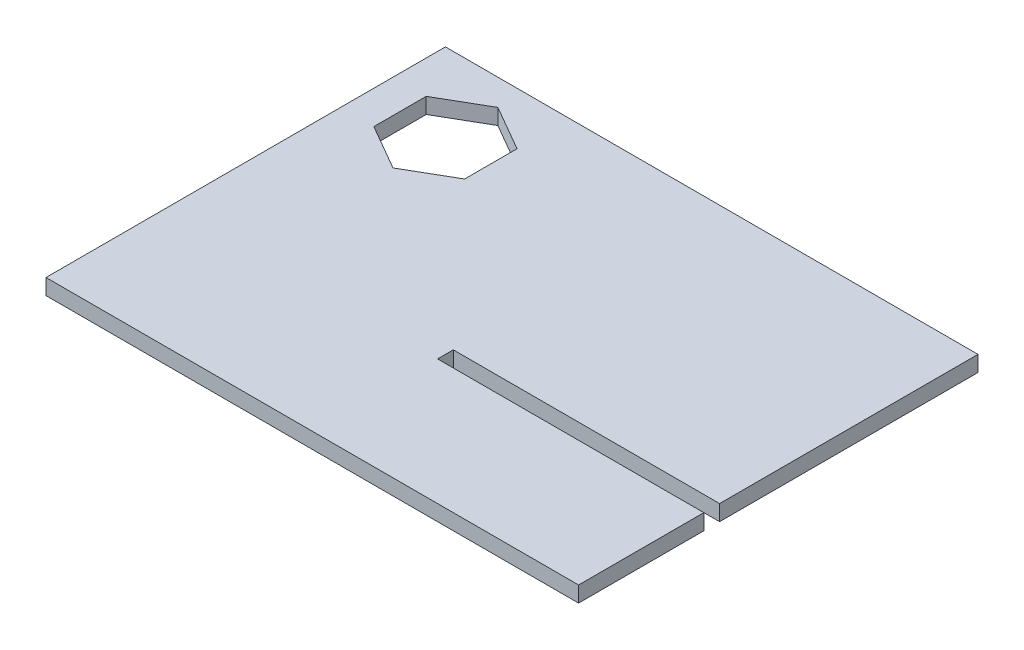
ISO-10303-21;
HEADER;
FILE_DESCRIPTION(('STEP AP214'),'2;1');
FILE_NAME('part.step','',(''),(''),'','','');
FILE_SCHEMA(('AUTOMOTIVE_DESIGN { 1 0 10303 214 1 1 1 1 }'));
ENDSEC;
DATA;
#1=APPLICATION_CONTEXT('core data for automotive mechanical design processes');
#2=APPLICATION_PROTOCOL_DEFINITION('international standard','automotive_design',2000,#1);
#3=PRODUCT_CONTEXT('',#1,'mechanical');
#4=PRODUCT('Part','Part','',(#3));
#5=PRODUCT_RELATED_PRODUCT_CATEGORY('part','',(#4));
#6=PRODUCT_DEFINITION_FORMATION('','',#4);
#7=PRODUCT_DEFINITION_CONTEXT('part definition',#1,'design');
#8=PRODUCT_DEFINITION('design','',#6,#7);
#9=PRODUCT_DEFINITION_SHAPE('','',#8);
#10=(LENGTH_UNIT() NAMED_UNIT(*) SI_UNIT(.MILLI.,.METRE.));
#11=(NAMED_UNIT(*) PLANE_ANGLE_UNIT() SI_UNIT($,.RADIAN.));
#12=(NAMED_UNIT(*) SI_UNIT($,.STERADIAN.) SOLID_ANGLE_UNIT());
#13=UNCERTAINTY_MEASURE_WITH_UNIT(LENGTH_MEASURE(1.E-05),#10,'distance_accuracy_value','');
#14=(GEOMETRIC_REPRESENTATION_CONTEXT(3) GLOBAL_UNCERTAINTY_ASSIGNED_CONTEXT((#13)) GLOBAL_UNIT_ASSIGNED_CONTEXT((#10,
#11,#12)) REPRESENTATION_CONTEXT('',''));
#15=CARTESIAN_POINT('',(0.,0.,0.));
#16=DIRECTION('',(0.,0.,1.));
#17=DIRECTION('',(1.,0.,0.));
#18=AXIS2_PLACEMENT_3D('',#15,#16,#17);
#19=CARTESIAN_POINT('',(101.6,3.,0.));
#20=DIRECTION('',(-1.,0.,0.));
#21=DIRECTION('',(0.,0.,1.));
#22=AXIS2_PLACEMENT_3D('',#19,#20,#21);
#23=PLANE('',#22);
#24=DIRECTION('',(0.,0.,-1.));
#25=VECTOR('',#24,1.);
#26=CARTESIAN_POINT('',(101.6,0.,0.));
#27=LINE('',#26,#25);
#28=CARTESIAN_POINT('',(101.6,0.,0.));
#29=VERTEX_POINT('',#28);
#30=CARTESIAN_POINT('',(101.6,0.,-23.9));
#31=VERTEX_POINT('',#30);
#32=EDGE_CURVE('E231',#29,#31,#27,.T.);
#33=ORIENTED_EDGE('',*,*,#32,.T.);
#34=DIRECTION('',(0.,1.,0.));
#35=VECTOR('',#34,1.);
#36=CARTESIAN_POINT('',(101.6,0.,-23.9));
#37=LINE('',#36,#35);
#38=CARTESIAN_POINT('',(101.6,3.,-23.9));
#39=VERTEX_POINT('',#38);
#40=EDGE_CURVE('E204',#31,#39,#37,.T.);
#41=ORIENTED_EDGE('',*,*,#40,.T.);
#42=DIRECTION('',(0.,0.,-1.));
#43=VECTOR('',#42,1.);
#44=CARTESIAN_POINT('',(101.6,3.,0.));
#45=LINE('',#44,#43);
#46=CARTESIAN_POINT('',(101.6,3.,0.));
#47=VERTEX_POINT('',#46);
#48=EDGE_CURVE('E220',#47,#39,#45,.T.);
#49=ORIENTED_EDGE('',*,*,#48,.F.);
#50=DIRECTION('',(0.,-1.,0.));
#51=VECTOR('',#50,1.);
#52=CARTESIAN_POINT('',(101.6,3.,0.));
#53=LINE('',#52,#51);
#54=EDGE_CURVE('E41',#47,#29,#53,.T.);
#55=ORIENTED_EDGE('',*,*,#54,.T.);
#56=EDGE_LOOP('',(#33,#41,#49,#55));
#57=FACE_BOUND('',#56,.T.);
#58=ADVANCED_FACE('F33',(#57),#23,.F.);
#59=CARTESIAN_POINT('',(0.,3.,0.));
#60=DIRECTION('',(1.,0.,0.));
#61=DIRECTION('',(0.,0.,-1.));
#62=AXIS2_PLACEMENT_3D('',#59,#60,#61);
#63=PLANE('',#62);
#64=DIRECTION('',(0.,0.,1.));
#65=VECTOR('',#64,1.);
#66=CARTESIAN_POINT('',(0.,0.,0.));
#67=LINE('',#66,#65);
#68=CARTESIAN_POINT('',(0.,0.,-76.2));
#69=VERTEX_POINT('',#68);
#70=CARTESIAN_POINT('',(0.,0.,0.));
#71=VERTEX_POINT('',#70);
#72=EDGE_CURVE('E207',#69,#71,#67,.T.);
#73=ORIENTED_EDGE('',*,*,#72,.T.);
#74=DIRECTION('',(0.,-1.,0.));
#75=VECTOR('',#74,1.);
#76=CARTESIAN_POINT('',(0.,3.,0.));
#77=LINE('',#76,#75);
#78=CARTESIAN_POINT('',(0.,3.,0.));
#79=VERTEX_POINT('',#78);
#80=EDGE_CURVE('E11',#79,#71,#77,.T.);
#81=ORIENTED_EDGE('',*,*,#80,.F.);
#82=DIRECTION('',(0.,0.,1.));
#83=VECTOR('',#82,1.);
#84=CARTESIAN_POINT('',(0.,3.,0.));
#85=LINE('',#84,#83);
#86=CARTESIAN_POINT('',(0.,3.,-76.2));
#87=VERTEX_POINT('',#86);
#88=EDGE_CURVE('E213',#87,#79,#85,.T.);
#89=ORIENTED_EDGE('',*,*,#88,.F.);
#90=DIRECTION('',(0.,-1.,0.));
#91=VECTOR('',#90,1.);
#92=CARTESIAN_POINT('',(0.,3.,-76.2));
#93=LINE('',#92,#91);
#94=EDGE_CURVE('E225',#87,#69,#93,.T.);
#95=ORIENTED_EDGE('',*,*,#94,.T.);
#96=EDGE_LOOP('',(#73,#81,#89,#95));
#97=FACE_BOUND('',#96,.T.);
#98=ADVANCED_FACE('F35',(#97),#63,.F.);
#99=CARTESIAN_POINT('',(0.,3.,0.));
#100=DIRECTION('',(0.,0.,-1.));
#101=DIRECTION('',(-1.,0.,0.));
#102=AXIS2_PLACEMENT_3D('',#99,#100,#101);
#103=PLANE('',#102);
#104=DIRECTION('',(1.,0.,0.));
#105=VECTOR('',#104,1.);
#106=CARTESIAN_POINT('',(0.,0.,0.));
#107=LINE('',#106,#105);
#108=EDGE_CURVE('E228',#71,#29,#107,.T.);
#109=ORIENTED_EDGE('',*,*,#108,.T.);
#110=ORIENTED_EDGE('',*,*,#54,.F.);
#111=DIRECTION('',(1.,0.,0.));
#112=VECTOR('',#111,1.);
#113=CARTESIAN_POINT('',(0.,3.,0.));
#114=LINE('',#113,#112);
#115=EDGE_CURVE('E216',#79,#47,#114,.T.);
#116=ORIENTED_EDGE('',*,*,#115,.F.);
#117=ORIENTED_EDGE('',*,*,#80,.T.);
#118=EDGE_LOOP('',(#109,#110,#116,#117));
#119=FACE_BOUND('',#118,.T.);
#120=ADVANCED_FACE('F255',(#119),#103,.F.);
#121=CARTESIAN_POINT('',(101.6,3.,-26.9));
#122=VERTEX_POINT('',#121);
#123=CARTESIAN_POINT('',(101.6,3.,-76.2));
#124=VERTEX_POINT('',#123);
#125=EDGE_CURVE('E219',#122,#124,#45,.T.);
#126=ORIENTED_EDGE('',*,*,#125,.F.);
#127=DIRECTION('',(0.,1.,0.));
#128=VECTOR('',#127,1.);
#129=CARTESIAN_POINT('',(101.6,0.,-26.9));
#130=LINE('',#129,#128);
#131=CARTESIAN_POINT('',(101.6,0.,-26.9));
#132=VERTEX_POINT('',#131);
#133=EDGE_CURVE('E197',#132,#122,#130,.T.);
#134=ORIENTED_EDGE('',*,*,#133,.F.);
#135=CARTESIAN_POINT('',(101.6,0.,-76.2));
#136=VERTEX_POINT('',#135);
#137=EDGE_CURVE('E230',#132,#136,#27,.T.);
#138=ORIENTED_EDGE('',*,*,#137,.T.);
#139=DIRECTION('',(0.,-1.,0.));
#140=VECTOR('',#139,1.);
#141=CARTESIAN_POINT('',(101.6,3.,-76.2));
#142=LINE('',#141,#140);
#143=EDGE_CURVE('E237',#124,#136,#142,.T.);
#144=ORIENTED_EDGE('',*,*,#143,.F.);
#145=EDGE_LOOP('',(#126,#134,#138,#144));
#146=FACE_BOUND('',#145,.T.);
#147=ADVANCED_FACE('F266',(#146),#23,.F.);
#148=CARTESIAN_POINT('',(0.,3.,-76.2));
#149=DIRECTION('',(0.,0.,1.));
#150=DIRECTION('',(1.,0.,0.));
#151=AXIS2_PLACEMENT_3D('',#148,#149,#150);
#152=PLANE('',#151);
#153=DIRECTION('',(-1.,0.,0.));
#154=VECTOR('',#153,1.);
#155=CARTESIAN_POINT('',(0.,0.,-76.2));
#156=LINE('',#155,#154);
#157=EDGE_CURVE('E217',#136,#69,#156,.T.);
#158=ORIENTED_EDGE('',*,*,#157,.T.);
#159=ORIENTED_EDGE('',*,*,#94,.F.);
#160=DIRECTION('',(-1.,0.,0.));
#161=VECTOR('',#160,1.);
#162=CARTESIAN_POINT('',(0.,3.,-76.2));
#163=LINE('',#162,#161);
#164=EDGE_CURVE('E223',#124,#87,#163,.T.);
#165=ORIENTED_EDGE('',*,*,#164,.F.);
#166=ORIENTED_EDGE('',*,*,#143,.T.);
#167=EDGE_LOOP('',(#158,#159,#165,#166));
#168=FACE_BOUND('',#167,.T.);
#169=ADVANCED_FACE('F261',(#168),#152,.F.);
#170=CARTESIAN_POINT('',(0.,3.,0.));
#171=DIRECTION('',(0.,-1.,0.));
#172=DIRECTION('',(0.,0.,-1.));
#173=AXIS2_PLACEMENT_3D('',#170,#171,#172);
#174=PLANE('',#173);
#175=DIRECTION('',(0.866025403784438,0.,-0.5));
#176=VECTOR('',#175,1.);
#177=CARTESIAN_POINT('',(15.,3.,-51.2));
#178=LINE('',#177,#176);
#179=CARTESIAN_POINT('',(15.,3.,-51.2));
#180=VERTEX_POINT('',#179);
#181=CARTESIAN_POINT('',(23.6602540378444,3.,-56.2));
#182=VERTEX_POINT('',#181);
#183=EDGE_CURVE('E167',#180,#182,#178,.T.);
#184=ORIENTED_EDGE('',*,*,#183,.F.);
#185=DIRECTION('',(0.866025403784439,0.,0.5));
#186=VECTOR('',#185,1.);
#187=CARTESIAN_POINT('',(6.3397459621556,3.,-56.2));
#188=LINE('',#187,#186);
#189=CARTESIAN_POINT('',(6.3397459621556,3.,-56.2));
#190=VERTEX_POINT('',#189);
#191=EDGE_CURVE('E48',#190,#180,#188,.T.);
#192=ORIENTED_EDGE('',*,*,#191,.F.);
#193=DIRECTION('',(0.,0.,1.));
#194=VECTOR('',#193,1.);
#195=CARTESIAN_POINT('',(6.3397459621556,3.,-66.2));
#196=LINE('',#195,#194);
#197=CARTESIAN_POINT('',(6.3397459621556,3.,-66.2));
#198=VERTEX_POINT('',#197);
#199=EDGE_CURVE('E153',#198,#190,#196,.T.);
#200=ORIENTED_EDGE('',*,*,#199,.F.);
#201=DIRECTION('',(-0.866025403784439,0.,0.5));
#202=VECTOR('',#201,1.);
#203=CARTESIAN_POINT('',(15.,3.,-71.2));
#204=LINE('',#203,#202);
#205=CARTESIAN_POINT('',(15.,3.,-71.2));
#206=VERTEX_POINT('',#205);
#207=EDGE_CURVE('E156',#206,#198,#204,.T.);
#208=ORIENTED_EDGE('',*,*,#207,.F.);
#209=DIRECTION('',(-0.866025403784438,0.,-0.500000000000001));
#210=VECTOR('',#209,1.);
#211=CARTESIAN_POINT('',(23.6602540378444,3.,-66.2));
#212=LINE('',#211,#210);
#213=CARTESIAN_POINT('',(23.6602540378444,3.,-66.2));
#214=VERTEX_POINT('',#213);
#215=EDGE_CURVE('E172',#214,#206,#212,.T.);
#216=ORIENTED_EDGE('',*,*,#215,.F.);
#217=DIRECTION('',(0.,0.,-1.));
#218=VECTOR('',#217,1.);
#219=CARTESIAN_POINT('',(23.6602540378444,3.,-56.2));
#220=LINE('',#219,#218);
#221=EDGE_CURVE('E169',#182,#214,#220,.T.);
#222=ORIENTED_EDGE('',*,*,#221,.F.);
#223=EDGE_LOOP('',(#184,#192,#200,#208,#216,#222));
#224=FACE_BOUND('',#223,.T.);
#225=ORIENTED_EDGE('',*,*,#48,.T.);
#226=DIRECTION('',(1.,0.,0.));
#227=VECTOR('',#226,1.);
#228=CARTESIAN_POINT('',(101.6,3.,-23.9));
#229=LINE('',#228,#227);
#230=CARTESIAN_POINT('',(50.8,3.,-23.9));
#231=VERTEX_POINT('',#230);
#232=EDGE_CURVE('E191',#231,#39,#229,.T.);
#233=ORIENTED_EDGE('',*,*,#232,.F.);
#234=DIRECTION('',(0.,0.,1.));
#235=VECTOR('',#234,1.);
#236=CARTESIAN_POINT('',(50.8,3.,-23.9));
#237=LINE('',#236,#235);
#238=CARTESIAN_POINT('',(50.8,3.,-26.9));
#239=VERTEX_POINT('',#238);
#240=EDGE_CURVE('E200',#239,#231,#237,.T.);
#241=ORIENTED_EDGE('',*,*,#240,.F.);
#242=DIRECTION('',(-1.,0.,0.));
#243=VECTOR('',#242,1.);
#244=CARTESIAN_POINT('',(101.6,3.,-26.9));
#245=LINE('',#244,#243);
#246=EDGE_CURVE('E179',#122,#239,#245,.T.);
#247=ORIENTED_EDGE('',*,*,#246,.F.);
#248=ORIENTED_EDGE('',*,*,#125,.T.);
#249=ORIENTED_EDGE('',*,*,#164,.T.);
#250=ORIENTED_EDGE('',*,*,#88,.T.);
#251=ORIENTED_EDGE('',*,*,#115,.T.);
#252=EDGE_LOOP('',(#225,#233,#241,#247,#248,#249,#250,#251));
#253=FACE_BOUND('',#252,.T.);
#254=ADVANCED_FACE('F251',(#224,#253),#174,.F.);
#255=CARTESIAN_POINT('',(0.,0.,0.));
#256=DIRECTION('',(0.,-1.,0.));
#257=DIRECTION('',(0.,0.,-1.));
#258=AXIS2_PLACEMENT_3D('',#255,#256,#257);
#259=PLANE('',#258);
#260=DIRECTION('',(0.866025403784439,0.,0.5));
#261=VECTOR('',#260,1.);
#262=CARTESIAN_POINT('',(6.3397459621556,0.,-56.2));
#263=LINE('',#262,#261);
#264=CARTESIAN_POINT('',(6.3397459621556,0.,-56.2));
#265=VERTEX_POINT('',#264);
#266=CARTESIAN_POINT('',(15.,0.,-51.2));
#267=VERTEX_POINT('',#266);
#268=EDGE_CURVE('E136',#265,#267,#263,.T.);
#269=ORIENTED_EDGE('',*,*,#268,.T.);
#270=DIRECTION('',(0.866025403784438,0.,-0.5));
#271=VECTOR('',#270,1.);
#272=CARTESIAN_POINT('',(15.,0.,-51.2));
#273=LINE('',#272,#271);
#274=CARTESIAN_POINT('',(23.6602540378444,0.,-56.2));
#275=VERTEX_POINT('',#274);
#276=EDGE_CURVE('E145',#267,#275,#273,.T.);
#277=ORIENTED_EDGE('',*,*,#276,.T.);
#278=DIRECTION('',(0.,0.,-1.));
#279=VECTOR('',#278,1.);
#280=CARTESIAN_POINT('',(23.6602540378444,0.,-56.2));
#281=LINE('',#280,#279);
#282=CARTESIAN_POINT('',(23.6602540378444,0.,-66.2));
#283=VERTEX_POINT('',#282);
#284=EDGE_CURVE('E56',#275,#283,#281,.T.);
#285=ORIENTED_EDGE('',*,*,#284,.T.);
#286=DIRECTION('',(-0.866025403784438,0.,-0.500000000000001));
#287=VECTOR('',#286,1.);
#288=CARTESIAN_POINT('',(23.6602540378444,0.,-66.2));
#289=LINE('',#288,#287);
#290=CARTESIAN_POINT('',(15.,0.,-71.2));
#291=VERTEX_POINT('',#290);
#292=EDGE_CURVE('E160',#283,#291,#289,.T.);
#293=ORIENTED_EDGE('',*,*,#292,.T.);
#294=DIRECTION('',(-0.866025403784439,0.,0.5));
#295=VECTOR('',#294,1.);
#296=CARTESIAN_POINT('',(15.,0.,-71.2));
#297=LINE('',#296,#295);
#298=CARTESIAN_POINT('',(6.3397459621556,0.,-66.2));
#299=VERTEX_POINT('',#298);
#300=EDGE_CURVE('E163',#291,#299,#297,.T.);
#301=ORIENTED_EDGE('',*,*,#300,.T.);
#302=DIRECTION('',(0.,0.,1.));
#303=VECTOR('',#302,1.);
#304=CARTESIAN_POINT('',(6.3397459621556,0.,-66.2));
#305=LINE('',#304,#303);
#306=EDGE_CURVE('E142',#299,#265,#305,.T.);
#307=ORIENTED_EDGE('',*,*,#306,.T.);
#308=EDGE_LOOP('',(#269,#277,#285,#293,#301,#307));
#309=FACE_BOUND('',#308,.T.);
#310=DIRECTION('',(1.,0.,0.));
#311=VECTOR('',#310,1.);
#312=CARTESIAN_POINT('',(101.6,0.,-23.9));
#313=LINE('',#312,#311);
#314=CARTESIAN_POINT('',(50.8,0.,-23.9));
#315=VERTEX_POINT('',#314);
#316=EDGE_CURVE('E194',#315,#31,#313,.T.);
#317=ORIENTED_EDGE('',*,*,#316,.T.);
#318=ORIENTED_EDGE('',*,*,#32,.F.);
#319=ORIENTED_EDGE('',*,*,#108,.F.);
#320=ORIENTED_EDGE('',*,*,#72,.F.);
#321=ORIENTED_EDGE('',*,*,#157,.F.);
#322=ORIENTED_EDGE('',*,*,#137,.F.);
#323=DIRECTION('',(-1.,0.,0.));
#324=VECTOR('',#323,1.);
#325=CARTESIAN_POINT('',(101.6,0.,-26.9));
#326=LINE('',#325,#324);
#327=CARTESIAN_POINT('',(50.8,0.,-26.9));
#328=VERTEX_POINT('',#327);
#329=EDGE_CURVE('E187',#132,#328,#326,.T.);
#330=ORIENTED_EDGE('',*,*,#329,.T.);
#331=DIRECTION('',(0.,0.,1.));
#332=VECTOR('',#331,1.);
#333=CARTESIAN_POINT('',(50.8,0.,-23.9));
#334=LINE('',#333,#332);
#335=EDGE_CURVE('E190',#328,#315,#334,.T.);
#336=ORIENTED_EDGE('',*,*,#335,.T.);
#337=EDGE_LOOP('',(#317,#318,#319,#320,#321,#322,#330,#336));
#338=FACE_BOUND('',#337,.T.);
#339=ADVANCED_FACE('F149',(#309,#338),#259,.T.);
#340=CARTESIAN_POINT('',(101.6,0.,-23.9));
#341=DIRECTION('',(0.,0.,1.));
#342=DIRECTION('',(1.,0.,0.));
#343=AXIS2_PLACEMENT_3D('',#340,#341,#342);
#344=PLANE('',#343);
#345=ORIENTED_EDGE('',*,*,#232,.T.);
#346=ORIENTED_EDGE('',*,*,#40,.F.);
#347=ORIENTED_EDGE('',*,*,#316,.F.);
#348=DIRECTION('',(0.,1.,0.));
#349=VECTOR('',#348,1.);
#350=CARTESIAN_POINT('',(50.8,0.,-23.9));
#351=LINE('',#350,#349);
#352=EDGE_CURVE('E208',#315,#231,#351,.T.);
#353=ORIENTED_EDGE('',*,*,#352,.T.);
#354=EDGE_LOOP('',(#345,#346,#347,#353));
#355=FACE_BOUND('',#354,.T.);
#356=ADVANCED_FACE('F248',(#355),#344,.F.);
#357=CARTESIAN_POINT('',(50.8,0.,-23.9));
#358=DIRECTION('',(-1.,0.,0.));
#359=DIRECTION('',(0.,0.,1.));
#360=AXIS2_PLACEMENT_3D('',#357,#358,#359);
#361=PLANE('',#360);
#362=ORIENTED_EDGE('',*,*,#240,.T.);
#363=ORIENTED_EDGE('',*,*,#352,.F.);
#364=ORIENTED_EDGE('',*,*,#335,.F.);
#365=DIRECTION('',(0.,1.,0.));
#366=VECTOR('',#365,1.);
#367=CARTESIAN_POINT('',(50.8,0.,-26.9));
#368=LINE('',#367,#366);
#369=EDGE_CURVE('E210',#328,#239,#368,.T.);
#370=ORIENTED_EDGE('',*,*,#369,.T.);
#371=EDGE_LOOP('',(#362,#363,#364,#370));
#372=FACE_BOUND('',#371,.T.);
#373=ADVANCED_FACE('F273',(#372),#361,.F.);
#374=CARTESIAN_POINT('',(101.6,0.,-26.9));
#375=DIRECTION('',(0.,0.,-1.));
#376=DIRECTION('',(-1.,0.,0.));
#377=AXIS2_PLACEMENT_3D('',#374,#375,#376);
#378=PLANE('',#377);
#379=ORIENTED_EDGE('',*,*,#246,.T.);
#380=ORIENTED_EDGE('',*,*,#369,.F.);
#381=ORIENTED_EDGE('',*,*,#329,.F.);
#382=ORIENTED_EDGE('',*,*,#133,.T.);
#383=EDGE_LOOP('',(#379,#380,#381,#382));
#384=FACE_BOUND('',#383,.T.);
#385=ADVANCED_FACE('F270',(#384),#378,.F.);
#386=CARTESIAN_POINT('',(6.3397459621556,0.,-56.2));
#387=DIRECTION('',(-0.5,0.,0.866025403784439));
#388=DIRECTION('',(0.866025403784439,0.,0.5));
#389=AXIS2_PLACEMENT_3D('',#386,#387,#388);
#390=PLANE('',#389);
#391=ORIENTED_EDGE('',*,*,#191,.T.);
#392=DIRECTION('',(0.,1.,0.));
#393=VECTOR('',#392,1.);
#394=CARTESIAN_POINT('',(15.,0.,-51.2));
#395=LINE('',#394,#393);
#396=EDGE_CURVE('E132',#267,#180,#395,.T.);
#397=ORIENTED_EDGE('',*,*,#396,.F.);
#398=ORIENTED_EDGE('',*,*,#268,.F.);
#399=DIRECTION('',(0.,1.,0.));
#400=VECTOR('',#399,1.);
#401=CARTESIAN_POINT('',(6.3397459621556,0.,-56.2));
#402=LINE('',#401,#400);
#403=EDGE_CURVE('E177',#265,#190,#402,.T.);
#404=ORIENTED_EDGE('',*,*,#403,.T.);
#405=EDGE_LOOP('',(#391,#397,#398,#404));
#406=FACE_BOUND('',#405,.T.);
#407=ADVANCED_FACE('F134',(#406),#390,.F.);
#408=CARTESIAN_POINT('',(6.3397459621556,0.,-66.2));
#409=DIRECTION('',(-1.,0.,0.));
#410=DIRECTION('',(0.,0.,1.));
#411=AXIS2_PLACEMENT_3D('',#408,#409,#410);
#412=PLANE('',#411);
#413=ORIENTED_EDGE('',*,*,#199,.T.);
#414=ORIENTED_EDGE('',*,*,#403,.F.);
#415=ORIENTED_EDGE('',*,*,#306,.F.);
#416=DIRECTION('',(0.,1.,0.));
#417=VECTOR('',#416,1.);
#418=CARTESIAN_POINT('',(6.3397459621556,0.,-66.2));
#419=LINE('',#418,#417);
#420=EDGE_CURVE('E180',#299,#198,#419,.T.);
#421=ORIENTED_EDGE('',*,*,#420,.T.);
#422=EDGE_LOOP('',(#413,#414,#415,#421));
#423=FACE_BOUND('',#422,.T.);
#424=ADVANCED_FACE('F353',(#423),#412,.F.);
#425=CARTESIAN_POINT('',(15.,0.,-71.2));
#426=DIRECTION('',(-0.5,0.,-0.866025403784438));
#427=DIRECTION('',(-0.866025403784439,0.,0.5));
#428=AXIS2_PLACEMENT_3D('',#425,#426,#427);
#429=PLANE('',#428);
#430=ORIENTED_EDGE('',*,*,#207,.T.);
#431=ORIENTED_EDGE('',*,*,#420,.F.);
#432=ORIENTED_EDGE('',*,*,#300,.F.);
#433=DIRECTION('',(0.,1.,0.));
#434=VECTOR('',#433,1.);
#435=CARTESIAN_POINT('',(15.,0.,-71.2));
#436=LINE('',#435,#434);
#437=EDGE_CURVE('E182',#291,#206,#436,.T.);
#438=ORIENTED_EDGE('',*,*,#437,.T.);
#439=EDGE_LOOP('',(#430,#431,#432,#438));
#440=FACE_BOUND('',#439,.T.);
#441=ADVANCED_FACE('F361',(#440),#429,.F.);
#442=CARTESIAN_POINT('',(23.6602540378444,0.,-66.2));
#443=DIRECTION('',(0.500000000000001,0.,-0.866025403784438));
#444=DIRECTION('',(-0.866025403784438,0.,-0.500000000000001));
#445=AXIS2_PLACEMENT_3D('',#442,#443,#444);
#446=PLANE('',#445);
#447=ORIENTED_EDGE('',*,*,#215,.T.);
#448=ORIENTED_EDGE('',*,*,#437,.F.);
#449=ORIENTED_EDGE('',*,*,#292,.F.);
#450=DIRECTION('',(0.,1.,0.));
#451=VECTOR('',#450,1.);
#452=CARTESIAN_POINT('',(23.6602540378444,0.,-66.2));
#453=LINE('',#452,#451);
#454=EDGE_CURVE('E184',#283,#214,#453,.T.);
#455=ORIENTED_EDGE('',*,*,#454,.T.);
#456=EDGE_LOOP('',(#447,#448,#449,#455));
#457=FACE_BOUND('',#456,.T.);
#458=ADVANCED_FACE('F370',(#457),#446,.F.);
#459=CARTESIAN_POINT('',(23.6602540378444,0.,-56.2));
#460=DIRECTION('',(1.,0.,0.));
#461=DIRECTION('',(0.,0.,-1.));
#462=AXIS2_PLACEMENT_3D('',#459,#460,#461);
#463=PLANE('',#462);
#464=ORIENTED_EDGE('',*,*,#221,.T.);
#465=ORIENTED_EDGE('',*,*,#454,.F.);
#466=ORIENTED_EDGE('',*,*,#284,.F.);
#467=DIRECTION('',(0.,1.,0.));
#468=VECTOR('',#467,1.);
#469=CARTESIAN_POINT('',(23.6602540378444,0.,-56.2));
#470=LINE('',#469,#468);
#471=EDGE_CURVE('E141',#275,#182,#470,.T.);
#472=ORIENTED_EDGE('',*,*,#471,.T.);
#473=EDGE_LOOP('',(#464,#465,#466,#472));
#474=FACE_BOUND('',#473,.T.);
#475=ADVANCED_FACE('F379',(#474),#463,.F.);
#476=CARTESIAN_POINT('',(15.,0.,-51.2));
#477=DIRECTION('',(0.5,0.,0.866025403784438));
#478=DIRECTION('',(0.866025403784438,0.,-0.5));
#479=AXIS2_PLACEMENT_3D('',#476,#477,#478);
#480=PLANE('',#479);
#481=ORIENTED_EDGE('',*,*,#183,.T.);
#482=ORIENTED_EDGE('',*,*,#471,.F.);
#483=ORIENTED_EDGE('',*,*,#276,.F.);
#484=ORIENTED_EDGE('',*,*,#396,.T.);
#485=EDGE_LOOP('',(#481,#482,#483,#484));
#486=FACE_BOUND('',#485,.T.);
#487=ADVANCED_FACE('F146',(#486),#480,.F.);
#488=CLOSED_SHELL('',(#58,#98,#120,#147,#169,#254,#339,#356,#373,#385,#407,#424,#441,#458,#475,#487));
#489=MANIFOLD_SOLID_BREP('B2',#488);
#490=ADVANCED_BREP_SHAPE_REPRESENTATION('',(#18,#489),#14);
#491=SHAPE_DEFINITION_REPRESENTATION(#9,#490);
ENDSEC;
END-ISO-10303-21;
